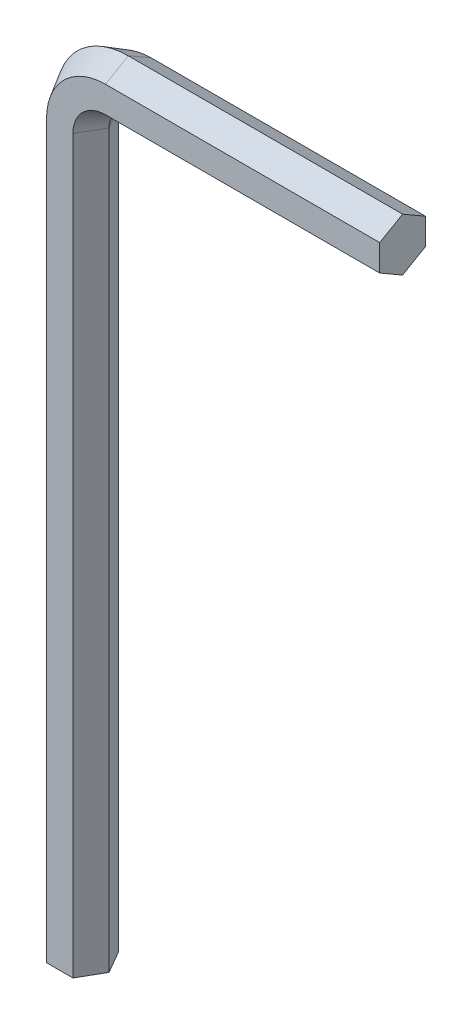
ISO-10303-21;
HEADER;
FILE_DESCRIPTION(('STEP AP214'),'2;1');
FILE_NAME('part.step','',(''),(''),'','','');
FILE_SCHEMA(('AUTOMOTIVE_DESIGN { 1 0 10303 214 1 1 1 1 }'));
ENDSEC;
DATA;
#1=APPLICATION_CONTEXT('core data for automotive mechanical design processes');
#2=APPLICATION_PROTOCOL_DEFINITION('international standard','automotive_design',2000,#1);
#3=PRODUCT_CONTEXT('',#1,'mechanical');
#4=PRODUCT('Part','Part','',(#3));
#5=PRODUCT_RELATED_PRODUCT_CATEGORY('part','',(#4));
#6=PRODUCT_DEFINITION_FORMATION('','',#4);
#7=PRODUCT_DEFINITION_CONTEXT('part definition',#1,'design');
#8=PRODUCT_DEFINITION('design','',#6,#7);
#9=PRODUCT_DEFINITION_SHAPE('','',#8);
#10=(LENGTH_UNIT() NAMED_UNIT(*) SI_UNIT(.MILLI.,.METRE.));
#11=(NAMED_UNIT(*) PLANE_ANGLE_UNIT() SI_UNIT($,.RADIAN.));
#12=(NAMED_UNIT(*) SI_UNIT($,.STERADIAN.) SOLID_ANGLE_UNIT());
#13=UNCERTAINTY_MEASURE_WITH_UNIT(LENGTH_MEASURE(1.E-05),#10,'distance_accuracy_value','');
#14=(GEOMETRIC_REPRESENTATION_CONTEXT(3) GLOBAL_UNCERTAINTY_ASSIGNED_CONTEXT((#13)) GLOBAL_UNIT_ASSIGNED_CONTEXT((#10,
#11,#12)) REPRESENTATION_CONTEXT('',''));
#15=CARTESIAN_POINT('',(0.,0.,0.));
#16=DIRECTION('',(0.,0.,1.));
#17=DIRECTION('',(1.,0.,0.));
#18=AXIS2_PLACEMENT_3D('',#15,#16,#17);
#19=CARTESIAN_POINT('',(-19.05,-0.916543552338523,-1.58750000000001));
#20=DIRECTION('',(0.,0.,-1.));
#21=DIRECTION('',(0.,1.,0.));
#22=AXIS2_PLACEMENT_3D('',#19,#20,#21);
#23=PLANE('',#22);
#24=DIRECTION('',(0.,1.,0.));
#25=VECTOR('',#24,1.);
#26=CARTESIAN_POINT('',(0.,-0.916543552338523,-1.58750000000001));
#27=LINE('',#26,#25);
#28=CARTESIAN_POINT('',(0.,-0.916543552338523,-1.58750000000001));
#29=VERTEX_POINT('',#28);
#30=CARTESIAN_POINT('',(0.,0.916543552338539,-1.5875));
#31=VERTEX_POINT('',#30);
#32=EDGE_CURVE('E129',#29,#31,#27,.T.);
#33=ORIENTED_EDGE('',*,*,#32,.F.);
#34=DIRECTION('',(1.,0.,0.));
#35=VECTOR('',#34,1.);
#36=CARTESIAN_POINT('',(-19.05,-0.916543552338523,-1.58750000000001));
#37=LINE('',#36,#35);
#38=CARTESIAN_POINT('',(-19.05,-0.916543552338523,-1.58750000000001));
#39=VERTEX_POINT('',#38);
#40=EDGE_CURVE('E11',#39,#29,#37,.T.);
#41=ORIENTED_EDGE('',*,*,#40,.F.);
#42=CARTESIAN_POINT('',(-19.05,-3.175,-1.58750000000001));
#43=DIRECTION('',(0.,0.,-1.));
#44=DIRECTION('',(-1.,0.,0.));
#45=AXIS2_PLACEMENT_3D('',#42,#43,#44);
#46=CIRCLE('',#45,2.25845644766148);
#47=CARTESIAN_POINT('',(-21.3084564476615,-3.17500000000001,-1.58750000000001));
#48=VERTEX_POINT('',#47);
#49=EDGE_CURVE('E219',#48,#39,#46,.T.);
#50=ORIENTED_EDGE('',*,*,#49,.F.);
#51=DIRECTION('',(0.,1.,0.));
#52=VECTOR('',#51,1.);
#53=CARTESIAN_POINT('',(-21.3084564476613,-53.975,-1.58750000000001));
#54=LINE('',#53,#52);
#55=CARTESIAN_POINT('',(-21.3084564476613,-53.975,-1.58750000000001));
#56=VERTEX_POINT('',#55);
#57=EDGE_CURVE('E200',#56,#48,#54,.T.);
#58=ORIENTED_EDGE('',*,*,#57,.F.);
#59=DIRECTION('',(1.,0.,0.));
#60=VECTOR('',#59,1.);
#61=CARTESIAN_POINT('',(-23.1415435523384,-53.975,-1.5875));
#62=LINE('',#61,#60);
#63=CARTESIAN_POINT('',(-23.1415435523384,-53.975,-1.5875));
#64=VERTEX_POINT('',#63);
#65=EDGE_CURVE('E255',#64,#56,#62,.T.);
#66=ORIENTED_EDGE('',*,*,#65,.F.);
#67=DIRECTION('',(0.,1.,0.));
#68=VECTOR('',#67,1.);
#69=CARTESIAN_POINT('',(-23.1415435523384,-53.975,-1.5875));
#70=LINE('',#69,#68);
#71=CARTESIAN_POINT('',(-23.1415435523385,-3.17500000000001,-1.5875));
#72=VERTEX_POINT('',#71);
#73=EDGE_CURVE('E203',#64,#72,#70,.T.);
#74=ORIENTED_EDGE('',*,*,#73,.T.);
#75=CARTESIAN_POINT('',(-19.05,-3.175,-1.5875));
#76=DIRECTION('',(0.,0.,-1.));
#77=DIRECTION('',(-1.,0.,0.));
#78=AXIS2_PLACEMENT_3D('',#75,#76,#77);
#79=CIRCLE('',#78,4.09154355233854);
#80=CARTESIAN_POINT('',(-19.05,0.916543552338539,-1.5875));
#81=VERTEX_POINT('',#80);
#82=EDGE_CURVE('E132',#72,#81,#79,.T.);
#83=ORIENTED_EDGE('',*,*,#82,.T.);
#84=DIRECTION('',(1.,0.,0.));
#85=VECTOR('',#84,1.);
#86=CARTESIAN_POINT('',(-19.05,0.916543552338539,-1.5875));
#87=LINE('',#86,#85);
#88=EDGE_CURVE('E44',#81,#31,#87,.T.);
#89=ORIENTED_EDGE('',*,*,#88,.T.);
#90=EDGE_LOOP('',(#33,#41,#50,#58,#66,#74,#83,#89));
#91=FACE_BOUND('',#90,.T.);
#92=ADVANCED_FACE('F41',(#91),#23,.T.);
#93=CARTESIAN_POINT('',(-19.05,-1.83308710467706,0.));
#94=DIRECTION('',(0.,-0.866025403784436,-0.500000000000005));
#95=DIRECTION('',(0.,0.500000000000005,-0.866025403784436));
#96=AXIS2_PLACEMENT_3D('',#93,#94,#95);
#97=PLANE('',#96);
#98=DIRECTION('',(0.,0.500000000000005,-0.866025403784436));
#99=VECTOR('',#98,1.);
#100=CARTESIAN_POINT('',(0.,-1.83308710467706,0.));
#101=LINE('',#100,#99);
#102=CARTESIAN_POINT('',(0.,-1.83308710467706,0.));
#103=VERTEX_POINT('',#102);
#104=EDGE_CURVE('E98',#103,#29,#101,.T.);
#105=ORIENTED_EDGE('',*,*,#104,.F.);
#106=DIRECTION('',(1.,0.,0.));
#107=VECTOR('',#106,1.);
#108=CARTESIAN_POINT('',(-19.05,-1.83308710467706,0.));
#109=LINE('',#108,#107);
#110=CARTESIAN_POINT('',(-19.05,-1.83308710467706,0.));
#111=VERTEX_POINT('',#110);
#112=EDGE_CURVE('E50',#111,#103,#109,.T.);
#113=ORIENTED_EDGE('',*,*,#112,.F.);
#114=DIRECTION('',(0.,0.500000000000005,-0.866025403784436));
#115=VECTOR('',#114,1.);
#116=CARTESIAN_POINT('',(-19.05,-1.83308710467706,0.));
#117=LINE('',#116,#115);
#118=EDGE_CURVE('E119',#111,#39,#117,.T.);
#119=ORIENTED_EDGE('',*,*,#118,.T.);
#120=ORIENTED_EDGE('',*,*,#40,.T.);
#121=EDGE_LOOP('',(#105,#113,#119,#120));
#122=FACE_BOUND('',#121,.T.);
#123=ADVANCED_FACE('F103',(#122),#97,.T.);
#124=CARTESIAN_POINT('',(-19.05,-0.91654355233854,1.58749999999999));
#125=DIRECTION('',(0.,-0.866025403784441,0.499999999999996));
#126=DIRECTION('',(0.,-0.499999999999996,-0.866025403784441));
#127=AXIS2_PLACEMENT_3D('',#124,#125,#126);
#128=PLANE('',#127);
#129=DIRECTION('',(0.,-0.499999999999996,-0.866025403784441));
#130=VECTOR('',#129,1.);
#131=CARTESIAN_POINT('',(0.,-0.91654355233854,1.58749999999999));
#132=LINE('',#131,#130);
#133=CARTESIAN_POINT('',(0.,-0.91654355233854,1.58749999999999));
#134=VERTEX_POINT('',#133);
#135=EDGE_CURVE('E84',#134,#103,#132,.T.);
#136=ORIENTED_EDGE('',*,*,#135,.F.);
#137=DIRECTION('',(1.,0.,0.));
#138=VECTOR('',#137,1.);
#139=CARTESIAN_POINT('',(-19.05,-0.91654355233854,1.58749999999999));
#140=LINE('',#139,#138);
#141=CARTESIAN_POINT('',(-19.05,-0.91654355233854,1.58749999999999));
#142=VERTEX_POINT('',#141);
#143=EDGE_CURVE('E92',#142,#134,#140,.T.);
#144=ORIENTED_EDGE('',*,*,#143,.F.);
#145=DIRECTION('',(0.,-0.499999999999996,-0.866025403784441));
#146=VECTOR('',#145,1.);
#147=CARTESIAN_POINT('',(-19.05,-0.91654355233854,1.58749999999999));
#148=LINE('',#147,#146);
#149=EDGE_CURVE('E88',#142,#111,#148,.T.);
#150=ORIENTED_EDGE('',*,*,#149,.T.);
#151=ORIENTED_EDGE('',*,*,#112,.T.);
#152=EDGE_LOOP('',(#136,#144,#150,#151));
#153=FACE_BOUND('',#152,.T.);
#154=ADVANCED_FACE('F82',(#153),#128,.T.);
#155=CARTESIAN_POINT('',(-19.05,0.916543552338523,1.58750000000001));
#156=DIRECTION('',(0.,0.,1.));
#157=DIRECTION('',(0.,-1.,0.));
#158=AXIS2_PLACEMENT_3D('',#155,#156,#157);
#159=PLANE('',#158);
#160=DIRECTION('',(0.,-1.,0.));
#161=VECTOR('',#160,1.);
#162=CARTESIAN_POINT('',(0.,0.916543552338523,1.58750000000001));
#163=LINE('',#162,#161);
#164=CARTESIAN_POINT('',(0.,0.916543552338523,1.58750000000001));
#165=VERTEX_POINT('',#164);
#166=EDGE_CURVE('E101',#165,#134,#163,.T.);
#167=ORIENTED_EDGE('',*,*,#166,.F.);
#168=DIRECTION('',(1.,0.,0.));
#169=VECTOR('',#168,1.);
#170=CARTESIAN_POINT('',(-19.05,0.916543552338523,1.58750000000001));
#171=LINE('',#170,#169);
#172=CARTESIAN_POINT('',(-19.05,0.916543552338523,1.58750000000001));
#173=VERTEX_POINT('',#172);
#174=EDGE_CURVE('E113',#173,#165,#171,.T.);
#175=ORIENTED_EDGE('',*,*,#174,.F.);
#176=CARTESIAN_POINT('',(-19.05,-3.175,1.58750000000001));
#177=DIRECTION('',(0.,0.,-1.));
#178=DIRECTION('',(-1.,0.,0.));
#179=AXIS2_PLACEMENT_3D('',#176,#177,#178);
#180=CIRCLE('',#179,4.09154355233852);
#181=CARTESIAN_POINT('',(-23.1415435523385,-3.17500000000001,1.58750000000001));
#182=VERTEX_POINT('',#181);
#183=EDGE_CURVE('E167',#182,#173,#180,.T.);
#184=ORIENTED_EDGE('',*,*,#183,.F.);
#185=DIRECTION('',(0.,1.,0.));
#186=VECTOR('',#185,1.);
#187=CARTESIAN_POINT('',(-23.1415435523383,-53.975,1.58750000000001));
#188=LINE('',#187,#186);
#189=CARTESIAN_POINT('',(-23.1415435523383,-53.975,1.58750000000001));
#190=VERTEX_POINT('',#189);
#191=EDGE_CURVE('E172',#190,#182,#188,.T.);
#192=ORIENTED_EDGE('',*,*,#191,.F.);
#193=DIRECTION('',(-1.,0.,0.));
#194=VECTOR('',#193,1.);
#195=CARTESIAN_POINT('',(-21.3084564476613,-53.975,1.58749999999999));
#196=LINE('',#195,#194);
#197=CARTESIAN_POINT('',(-21.3084564476613,-53.975,1.58749999999999));
#198=VERTEX_POINT('',#197);
#199=EDGE_CURVE('E189',#198,#190,#196,.T.);
#200=ORIENTED_EDGE('',*,*,#199,.F.);
#201=DIRECTION('',(0.,1.,0.));
#202=VECTOR('',#201,1.);
#203=CARTESIAN_POINT('',(-21.3084564476613,-53.975,1.58749999999999));
#204=LINE('',#203,#202);
#205=CARTESIAN_POINT('',(-21.3084564476615,-3.17500000000001,1.58749999999999));
#206=VERTEX_POINT('',#205);
#207=EDGE_CURVE('E188',#198,#206,#204,.T.);
#208=ORIENTED_EDGE('',*,*,#207,.T.);
#209=CARTESIAN_POINT('',(-19.05,-3.175,1.58749999999999));
#210=DIRECTION('',(0.,0.,-1.));
#211=DIRECTION('',(-1.,0.,0.));
#212=AXIS2_PLACEMENT_3D('',#209,#210,#211);
#213=CIRCLE('',#212,2.25845644766146);
#214=EDGE_CURVE('E147',#206,#142,#213,.T.);
#215=ORIENTED_EDGE('',*,*,#214,.T.);
#216=ORIENTED_EDGE('',*,*,#143,.T.);
#217=EDGE_LOOP('',(#167,#175,#184,#192,#200,#208,#215,#216));
#218=FACE_BOUND('',#217,.T.);
#219=ADVANCED_FACE('F142',(#218),#159,.T.);
#220=CARTESIAN_POINT('',(-19.05,1.83308710467706,0.));
#221=DIRECTION('',(0.,0.866025403784436,0.500000000000005));
#222=DIRECTION('',(0.,-0.500000000000005,0.866025403784436));
#223=AXIS2_PLACEMENT_3D('',#220,#221,#222);
#224=PLANE('',#223);
#225=DIRECTION('',(0.,-0.500000000000005,0.866025403784436));
#226=VECTOR('',#225,1.);
#227=CARTESIAN_POINT('',(0.,1.83308710467706,0.));
#228=LINE('',#227,#226);
#229=CARTESIAN_POINT('',(0.,1.83308710467706,0.));
#230=VERTEX_POINT('',#229);
#231=EDGE_CURVE('E135',#230,#165,#228,.T.);
#232=ORIENTED_EDGE('',*,*,#231,.F.);
#233=DIRECTION('',(1.,0.,0.));
#234=VECTOR('',#233,1.);
#235=CARTESIAN_POINT('',(-19.05,1.83308710467706,0.));
#236=LINE('',#235,#234);
#237=CARTESIAN_POINT('',(-19.05,1.83308710467706,0.));
#238=VERTEX_POINT('',#237);
#239=EDGE_CURVE('E114',#238,#230,#236,.T.);
#240=ORIENTED_EDGE('',*,*,#239,.F.);
#241=DIRECTION('',(0.,-0.500000000000005,0.866025403784436));
#242=VECTOR('',#241,1.);
#243=CARTESIAN_POINT('',(-19.05,1.83308710467706,0.));
#244=LINE('',#243,#242);
#245=EDGE_CURVE('E58',#238,#173,#244,.T.);
#246=ORIENTED_EDGE('',*,*,#245,.T.);
#247=ORIENTED_EDGE('',*,*,#174,.T.);
#248=EDGE_LOOP('',(#232,#240,#246,#247));
#249=FACE_BOUND('',#248,.T.);
#250=ADVANCED_FACE('F137',(#249),#224,.T.);
#251=CARTESIAN_POINT('',(-19.05,0.916543552338539,-1.5875));
#252=DIRECTION('',(0.,0.866025403784441,-0.499999999999996));
#253=DIRECTION('',(0.,0.499999999999996,0.866025403784441));
#254=AXIS2_PLACEMENT_3D('',#251,#252,#253);
#255=PLANE('',#254);
#256=DIRECTION('',(0.,0.499999999999996,0.866025403784441));
#257=VECTOR('',#256,1.);
#258=CARTESIAN_POINT('',(0.,0.916543552338539,-1.5875));
#259=LINE('',#258,#257);
#260=EDGE_CURVE('E131',#31,#230,#259,.T.);
#261=ORIENTED_EDGE('',*,*,#260,.F.);
#262=ORIENTED_EDGE('',*,*,#88,.F.);
#263=DIRECTION('',(0.,0.499999999999996,0.866025403784441));
#264=VECTOR('',#263,1.);
#265=CARTESIAN_POINT('',(-19.05,0.916543552338539,-1.5875));
#266=LINE('',#265,#264);
#267=EDGE_CURVE('E106',#81,#238,#266,.T.);
#268=ORIENTED_EDGE('',*,*,#267,.T.);
#269=ORIENTED_EDGE('',*,*,#239,.T.);
#270=EDGE_LOOP('',(#261,#262,#268,#269));
#271=FACE_BOUND('',#270,.T.);
#272=ADVANCED_FACE('F230',(#271),#255,.T.);
#273=CARTESIAN_POINT('',(0.,0.,0.));
#274=DIRECTION('',(1.,0.,0.));
#275=DIRECTION('',(0.,0.,-1.));
#276=AXIS2_PLACEMENT_3D('',#273,#274,#275);
#277=PLANE('',#276);
#278=ORIENTED_EDGE('',*,*,#32,.T.);
#279=ORIENTED_EDGE('',*,*,#260,.T.);
#280=ORIENTED_EDGE('',*,*,#231,.T.);
#281=ORIENTED_EDGE('',*,*,#166,.T.);
#282=ORIENTED_EDGE('',*,*,#135,.T.);
#283=ORIENTED_EDGE('',*,*,#104,.T.);
#284=EDGE_LOOP('',(#278,#279,#280,#281,#282,#283));
#285=FACE_BOUND('',#284,.T.);
#286=ADVANCED_FACE('F97',(#285),#277,.T.);
#287=CARTESIAN_POINT('',(-19.05,-3.175,0.));
#288=DIRECTION('',(0.,0.,1.));
#289=DIRECTION('',(1.,0.,0.));
#290=AXIS2_PLACEMENT_3D('',#287,#288,#289);
#291=CONICAL_SURFACE('',#290,5.00808710467707,0.523598775598294);
#292=ORIENTED_EDGE('',*,*,#82,.F.);
#293=DIRECTION('',(0.499999999999996,0.,-0.866025403784441));
#294=VECTOR('',#293,1.);
#295=CARTESIAN_POINT('',(-24.0580871046771,-3.17500000000002,0.));
#296=LINE('',#295,#294);
#297=CARTESIAN_POINT('',(-24.0580871046771,-3.17500000000002,0.));
#298=VERTEX_POINT('',#297);
#299=EDGE_CURVE('E208',#298,#72,#296,.T.);
#300=ORIENTED_EDGE('',*,*,#299,.F.);
#301=CARTESIAN_POINT('',(-19.05,-3.175,0.));
#302=DIRECTION('',(0.,0.,-1.));
#303=DIRECTION('',(-1.,0.,0.));
#304=AXIS2_PLACEMENT_3D('',#301,#302,#303);
#305=CIRCLE('',#304,5.00808710467707);
#306=EDGE_CURVE('E174',#298,#238,#305,.T.);
#307=ORIENTED_EDGE('',*,*,#306,.T.);
#308=ORIENTED_EDGE('',*,*,#267,.F.);
#309=EDGE_LOOP('',(#292,#300,#307,#308));
#310=FACE_BOUND('',#309,.T.);
#311=ADVANCED_FACE('F229',(#310),#291,.T.);
#312=CARTESIAN_POINT('',(-19.05,-3.175,-1.58750000000001));
#313=DIRECTION('',(0.,0.,-1.));
#314=DIRECTION('',(-1.,0.,0.));
#315=AXIS2_PLACEMENT_3D('',#312,#313,#314);
#316=CONICAL_SURFACE('',#315,2.25845644766148,0.523598775598304);
#317=CARTESIAN_POINT('',(-19.05,-3.175,0.));
#318=DIRECTION('',(0.,0.,-1.));
#319=DIRECTION('',(-1.,0.,0.));
#320=AXIS2_PLACEMENT_3D('',#317,#318,#319);
#321=CIRCLE('',#320,1.34191289532294);
#322=CARTESIAN_POINT('',(-20.3919128953229,-3.175,0.));
#323=VERTEX_POINT('',#322);
#324=EDGE_CURVE('E217',#323,#111,#321,.T.);
#325=ORIENTED_EDGE('',*,*,#324,.F.);
#326=DIRECTION('',(0.500000000000005,0.,0.866025403784436));
#327=VECTOR('',#326,1.);
#328=CARTESIAN_POINT('',(-21.3084564476615,-3.17500000000001,-1.58750000000001));
#329=LINE('',#328,#327);
#330=EDGE_CURVE('E211',#48,#323,#329,.T.);
#331=ORIENTED_EDGE('',*,*,#330,.F.);
#332=ORIENTED_EDGE('',*,*,#49,.T.);
#333=ORIENTED_EDGE('',*,*,#118,.F.);
#334=EDGE_LOOP('',(#325,#331,#332,#333));
#335=FACE_BOUND('',#334,.T.);
#336=ADVANCED_FACE('F271',(#335),#316,.F.);
#337=CARTESIAN_POINT('',(-19.05,-3.175,0.));
#338=DIRECTION('',(0.,0.,1.));
#339=DIRECTION('',(1.,0.,0.));
#340=AXIS2_PLACEMENT_3D('',#337,#338,#339);
#341=CONICAL_SURFACE('',#340,1.34191289532294,0.523598775598293);
#342=ORIENTED_EDGE('',*,*,#214,.F.);
#343=DIRECTION('',(-0.499999999999996,0.,0.866025403784441));
#344=VECTOR('',#343,1.);
#345=CARTESIAN_POINT('',(-20.3919128953229,-3.175,0.));
#346=LINE('',#345,#344);
#347=EDGE_CURVE('E183',#323,#206,#346,.T.);
#348=ORIENTED_EDGE('',*,*,#347,.F.);
#349=ORIENTED_EDGE('',*,*,#324,.T.);
#350=ORIENTED_EDGE('',*,*,#149,.F.);
#351=EDGE_LOOP('',(#342,#348,#349,#350));
#352=FACE_BOUND('',#351,.T.);
#353=ADVANCED_FACE('F268',(#352),#341,.F.);
#354=CARTESIAN_POINT('',(-19.05,-3.175,1.58750000000001));
#355=DIRECTION('',(0.,0.,-1.));
#356=DIRECTION('',(-1.,0.,0.));
#357=AXIS2_PLACEMENT_3D('',#354,#355,#356);
#358=CONICAL_SURFACE('',#357,4.09154355233852,0.523598775598305);
#359=DIRECTION('',(-0.500000000000005,0.,-0.866025403784436));
#360=VECTOR('',#359,1.);
#361=CARTESIAN_POINT('',(-23.1415435523385,-3.17500000000001,1.58750000000001));
#362=LINE('',#361,#360);
#363=EDGE_CURVE('E177',#182,#298,#362,.T.);
#364=ORIENTED_EDGE('',*,*,#363,.F.);
#365=ORIENTED_EDGE('',*,*,#183,.T.);
#366=ORIENTED_EDGE('',*,*,#245,.F.);
#367=ORIENTED_EDGE('',*,*,#306,.F.);
#368=EDGE_LOOP('',(#364,#365,#366,#367));
#369=FACE_BOUND('',#368,.T.);
#370=ADVANCED_FACE('F178',(#369),#358,.T.);
#371=CARTESIAN_POINT('',(-23.1415435523383,-53.975,1.58750000000001));
#372=DIRECTION('',(0.866025403784435,0.,-0.500000000000006));
#373=DIRECTION('',(-0.500000000000006,0.,-0.866025403784435));
#374=AXIS2_PLACEMENT_3D('',#371,#372,#373);
#375=PLANE('',#374);
#376=ORIENTED_EDGE('',*,*,#363,.T.);
#377=DIRECTION('',(0.,1.,0.));
#378=VECTOR('',#377,1.);
#379=CARTESIAN_POINT('',(-24.0580871046769,-53.975,0.));
#380=LINE('',#379,#378);
#381=CARTESIAN_POINT('',(-24.0580871046769,-53.975,0.));
#382=VERTEX_POINT('',#381);
#383=EDGE_CURVE('E206',#382,#298,#380,.T.);
#384=ORIENTED_EDGE('',*,*,#383,.F.);
#385=DIRECTION('',(-0.500000000000006,0.,-0.866025403784435));
#386=VECTOR('',#385,1.);
#387=CARTESIAN_POINT('',(-23.1415435523383,-53.975,1.58750000000001));
#388=LINE('',#387,#386);
#389=EDGE_CURVE('E187',#190,#382,#388,.T.);
#390=ORIENTED_EDGE('',*,*,#389,.F.);
#391=ORIENTED_EDGE('',*,*,#191,.T.);
#392=EDGE_LOOP('',(#376,#384,#390,#391));
#393=FACE_BOUND('',#392,.T.);
#394=ADVANCED_FACE('F185',(#393),#375,.F.);
#395=CARTESIAN_POINT('',(-24.0580871046769,-53.975,0.));
#396=DIRECTION('',(0.866025403784441,0.,0.499999999999996));
#397=DIRECTION('',(0.499999999999996,0.,-0.866025403784441));
#398=AXIS2_PLACEMENT_3D('',#395,#396,#397);
#399=PLANE('',#398);
#400=ORIENTED_EDGE('',*,*,#299,.T.);
#401=ORIENTED_EDGE('',*,*,#73,.F.);
#402=DIRECTION('',(0.499999999999996,0.,-0.866025403784441));
#403=VECTOR('',#402,1.);
#404=CARTESIAN_POINT('',(-24.0580871046769,-53.975,0.));
#405=LINE('',#404,#403);
#406=EDGE_CURVE('E252',#382,#64,#405,.T.);
#407=ORIENTED_EDGE('',*,*,#406,.F.);
#408=ORIENTED_EDGE('',*,*,#383,.T.);
#409=EDGE_LOOP('',(#400,#401,#407,#408));
#410=FACE_BOUND('',#409,.T.);
#411=ADVANCED_FACE('F253',(#410),#399,.F.);
#412=CARTESIAN_POINT('',(-21.3084564476613,-53.975,-1.58750000000001));
#413=DIRECTION('',(-0.866025403784436,0.,0.500000000000004));
#414=DIRECTION('',(0.500000000000004,0.,0.866025403784436));
#415=AXIS2_PLACEMENT_3D('',#412,#413,#414);
#416=PLANE('',#415);
#417=ORIENTED_EDGE('',*,*,#330,.T.);
#418=DIRECTION('',(0.,1.,0.));
#419=VECTOR('',#418,1.);
#420=CARTESIAN_POINT('',(-20.3919128953228,-53.975,0.));
#421=LINE('',#420,#419);
#422=CARTESIAN_POINT('',(-20.3919128953228,-53.975,0.));
#423=VERTEX_POINT('',#422);
#424=EDGE_CURVE('E191',#423,#323,#421,.T.);
#425=ORIENTED_EDGE('',*,*,#424,.F.);
#426=DIRECTION('',(0.500000000000004,0.,0.866025403784436));
#427=VECTOR('',#426,1.);
#428=CARTESIAN_POINT('',(-21.3084564476613,-53.975,-1.58750000000001));
#429=LINE('',#428,#427);
#430=EDGE_CURVE('E261',#56,#423,#429,.T.);
#431=ORIENTED_EDGE('',*,*,#430,.F.);
#432=ORIENTED_EDGE('',*,*,#57,.T.);
#433=EDGE_LOOP('',(#417,#425,#431,#432));
#434=FACE_BOUND('',#433,.T.);
#435=ADVANCED_FACE('F270',(#434),#416,.F.);
#436=CARTESIAN_POINT('',(-20.3919128953228,-53.975,0.));
#437=DIRECTION('',(-0.866025403784442,0.,-0.499999999999995));
#438=DIRECTION('',(-0.499999999999995,0.,0.866025403784442));
#439=AXIS2_PLACEMENT_3D('',#436,#437,#438);
#440=PLANE('',#439);
#441=ORIENTED_EDGE('',*,*,#347,.T.);
#442=ORIENTED_EDGE('',*,*,#207,.F.);
#443=DIRECTION('',(-0.499999999999995,0.,0.866025403784442));
#444=VECTOR('',#443,1.);
#445=CARTESIAN_POINT('',(-20.3919128953228,-53.975,0.));
#446=LINE('',#445,#444);
#447=EDGE_CURVE('E194',#423,#198,#446,.T.);
#448=ORIENTED_EDGE('',*,*,#447,.F.);
#449=ORIENTED_EDGE('',*,*,#424,.T.);
#450=EDGE_LOOP('',(#441,#442,#448,#449));
#451=FACE_BOUND('',#450,.T.);
#452=ADVANCED_FACE('F267',(#451),#440,.F.);
#453=CARTESIAN_POINT('',(1.89385768803128E-13,-53.9749999999999,0.));
#454=DIRECTION('',(0.,-1.,0.));
#455=DIRECTION('',(1.,0.,0.));
#456=AXIS2_PLACEMENT_3D('',#453,#454,#455);
#457=PLANE('',#456);
#458=ORIENTED_EDGE('',*,*,#389,.T.);
#459=ORIENTED_EDGE('',*,*,#406,.T.);
#460=ORIENTED_EDGE('',*,*,#65,.T.);
#461=ORIENTED_EDGE('',*,*,#430,.T.);
#462=ORIENTED_EDGE('',*,*,#447,.T.);
#463=ORIENTED_EDGE('',*,*,#199,.T.);
#464=EDGE_LOOP('',(#458,#459,#460,#461,#462,#463));
#465=FACE_BOUND('',#464,.T.);
#466=ADVANCED_FACE('F257',(#465),#457,.T.);
#467=CLOSED_SHELL('',(#92,#123,#154,#219,#250,#272,#286,#311,#336,#353,#370,#394,#411,#435,#452,#466));
#468=MANIFOLD_SOLID_BREP('B2',#467);
#469=ADVANCED_BREP_SHAPE_REPRESENTATION('',(#18,#468),#14);
#470=SHAPE_DEFINITION_REPRESENTATION(#9,#469);
ENDSEC;
END-ISO-10303-21;
